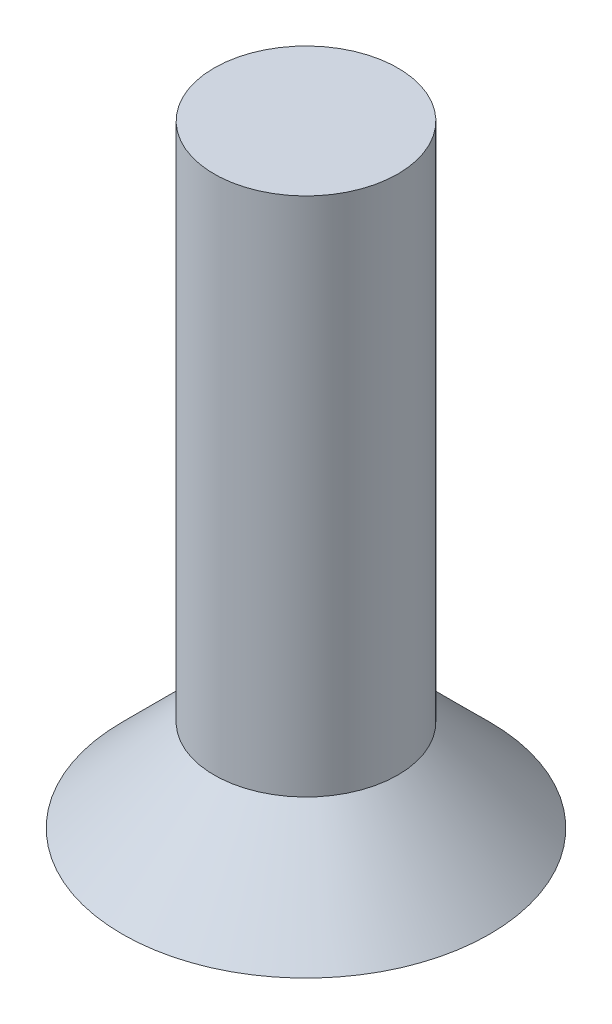
ISO-10303-21;
HEADER;
FILE_DESCRIPTION(('STEP AP214'),'2;1');
FILE_NAME('part.step','',(''),(''),'','','');
FILE_SCHEMA(('AUTOMOTIVE_DESIGN { 1 0 10303 214 1 1 1 1 }'));
ENDSEC;
DATA;
#1=APPLICATION_CONTEXT('core data for automotive mechanical design processes');
#2=APPLICATION_PROTOCOL_DEFINITION('international standard','automotive_design',2000,#1);
#3=PRODUCT_CONTEXT('',#1,'mechanical');
#4=PRODUCT('Part','Part','',(#3));
#5=PRODUCT_RELATED_PRODUCT_CATEGORY('part','',(#4));
#6=PRODUCT_DEFINITION_FORMATION('','',#4);
#7=PRODUCT_DEFINITION_CONTEXT('part definition',#1,'design');
#8=PRODUCT_DEFINITION('design','',#6,#7);
#9=PRODUCT_DEFINITION_SHAPE('','',#8);
#10=(LENGTH_UNIT() NAMED_UNIT(*) SI_UNIT(.MILLI.,.METRE.));
#11=(NAMED_UNIT(*) PLANE_ANGLE_UNIT() SI_UNIT($,.RADIAN.));
#12=(NAMED_UNIT(*) SI_UNIT($,.STERADIAN.) SOLID_ANGLE_UNIT());
#13=UNCERTAINTY_MEASURE_WITH_UNIT(LENGTH_MEASURE(1.E-05),#10,'distance_accuracy_value','');
#14=(GEOMETRIC_REPRESENTATION_CONTEXT(3) GLOBAL_UNCERTAINTY_ASSIGNED_CONTEXT((#13)) GLOBAL_UNIT_ASSIGNED_CONTEXT((#10,
#11,#12)) REPRESENTATION_CONTEXT('',''));
#15=CARTESIAN_POINT('',(0.,0.,0.));
#16=DIRECTION('',(0.,0.,1.));
#17=DIRECTION('',(1.,0.,0.));
#18=AXIS2_PLACEMENT_3D('',#15,#16,#17);
#19=CARTESIAN_POINT('',(0.,0.,0.));
#20=DIRECTION('',(0.,-1.,0.));
#21=DIRECTION('',(1.,0.,0.));
#22=AXIS2_PLACEMENT_3D('',#19,#20,#21);
#23=PLANE('',#22);
#24=CARTESIAN_POINT('',(0.,0.,0.));
#25=DIRECTION('',(0.,1.,0.));
#26=DIRECTION('',(-1.,0.,0.));
#27=AXIS2_PLACEMENT_3D('',#24,#25,#26);
#28=CIRCLE('',#27,3.);
#29=CARTESIAN_POINT('',(-3.,0.,0.));
#30=VERTEX_POINT('',#29);
#31=EDGE_CURVE('E10',#30,#30,#28,.T.);
#32=ORIENTED_EDGE('',*,*,#31,.F.);
#33=EDGE_LOOP('',(#32));
#34=FACE_BOUND('',#33,.T.);
#35=ADVANCED_FACE('F33',(#34),#23,.T.);
#36=CARTESIAN_POINT('',(0.,1.49999999999998,0.));
#37=DIRECTION('',(0.,-1.,0.));
#38=DIRECTION('',(1.,0.,0.));
#39=AXIS2_PLACEMENT_3D('',#36,#37,#38);
#40=CONICAL_SURFACE('',#39,1.5,0.785398163397454);
#41=ORIENTED_EDGE('',*,*,#31,.T.);
#42=EDGE_LOOP('',(#41));
#43=FACE_BOUND('',#42,.T.);
#44=CARTESIAN_POINT('',(0.,1.49999999999998,0.));
#45=DIRECTION('',(0.,1.,0.));
#46=DIRECTION('',(-1.,0.,0.));
#47=AXIS2_PLACEMENT_3D('',#44,#45,#46);
#48=CIRCLE('',#47,1.5);
#49=CARTESIAN_POINT('',(-1.5,1.49999999999998,0.));
#50=VERTEX_POINT('',#49);
#51=EDGE_CURVE('E39',#50,#50,#48,.T.);
#52=ORIENTED_EDGE('',*,*,#51,.F.);
#53=EDGE_LOOP('',(#52));
#54=FACE_BOUND('',#53,.T.);
#55=ADVANCED_FACE('F54',(#43,#54),#40,.T.);
#56=CARTESIAN_POINT('',(0.,10.,0.));
#57=DIRECTION('',(0.,1.,0.));
#58=DIRECTION('',(-1.,0.,0.));
#59=AXIS2_PLACEMENT_3D('',#56,#57,#58);
#60=CYLINDRICAL_SURFACE('',#59,1.5);
#61=ORIENTED_EDGE('',*,*,#51,.T.);
#62=EDGE_LOOP('',(#61));
#63=FACE_BOUND('',#62,.T.);
#64=CARTESIAN_POINT('',(0.,10.,0.));
#65=DIRECTION('',(0.,1.,0.));
#66=DIRECTION('',(-1.,0.,0.));
#67=AXIS2_PLACEMENT_3D('',#64,#65,#66);
#68=CIRCLE('',#67,1.5);
#69=CARTESIAN_POINT('',(-1.5,10.,0.));
#70=VERTEX_POINT('',#69);
#71=EDGE_CURVE('E43',#70,#70,#68,.T.);
#72=ORIENTED_EDGE('',*,*,#71,.F.);
#73=EDGE_LOOP('',(#72));
#74=FACE_BOUND('',#73,.T.);
#75=ADVANCED_FACE('F52',(#63,#74),#60,.T.);
#76=CARTESIAN_POINT('',(-1.5,10.,0.));
#77=DIRECTION('',(0.,1.,0.));
#78=DIRECTION('',(-1.,0.,0.));
#79=AXIS2_PLACEMENT_3D('',#76,#77,#78);
#80=PLANE('',#79);
#81=ORIENTED_EDGE('',*,*,#71,.T.);
#82=EDGE_LOOP('',(#81));
#83=FACE_BOUND('',#82,.T.);
#84=ADVANCED_FACE('F50',(#83),#80,.T.);
#85=CLOSED_SHELL('',(#35,#55,#75,#84));
#86=MANIFOLD_SOLID_BREP('B2',#85);
#87=ADVANCED_BREP_SHAPE_REPRESENTATION('',(#18,#86),#14);
#88=SHAPE_DEFINITION_REPRESENTATION(#9,#87);
ENDSEC;
END-ISO-10303-21;
